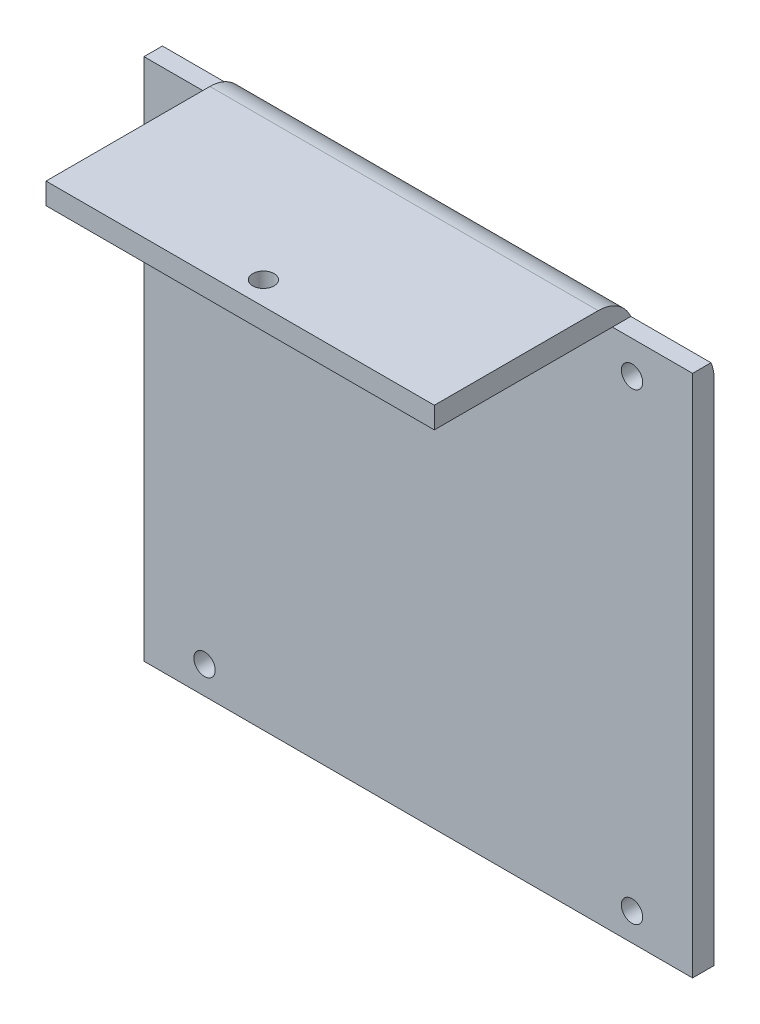
ISO-10303-21;
HEADER;
FILE_DESCRIPTION(('STEP AP214'),'2;1');
FILE_NAME('part.step','',(''),(''),'','','');
FILE_SCHEMA(('AUTOMOTIVE_DESIGN { 1 0 10303 214 1 1 1 1 }'));
ENDSEC;
DATA;
#1=APPLICATION_CONTEXT('core data for automotive mechanical design processes');
#2=APPLICATION_PROTOCOL_DEFINITION('international standard','automotive_design',2000,#1);
#3=PRODUCT_CONTEXT('',#1,'mechanical');
#4=PRODUCT('Part','Part','',(#3));
#5=PRODUCT_RELATED_PRODUCT_CATEGORY('part','',(#4));
#6=PRODUCT_DEFINITION_FORMATION('','',#4);
#7=PRODUCT_DEFINITION_CONTEXT('part definition',#1,'design');
#8=PRODUCT_DEFINITION('design','',#6,#7);
#9=PRODUCT_DEFINITION_SHAPE('','',#8);
#10=(LENGTH_UNIT() NAMED_UNIT(*) SI_UNIT(.MILLI.,.METRE.));
#11=(NAMED_UNIT(*) PLANE_ANGLE_UNIT() SI_UNIT($,.RADIAN.));
#12=(NAMED_UNIT(*) SI_UNIT($,.STERADIAN.) SOLID_ANGLE_UNIT());
#13=UNCERTAINTY_MEASURE_WITH_UNIT(LENGTH_MEASURE(1.E-05),#10,'distance_accuracy_value','');
#14=(GEOMETRIC_REPRESENTATION_CONTEXT(3) GLOBAL_UNCERTAINTY_ASSIGNED_CONTEXT((#13)) GLOBAL_UNIT_ASSIGNED_CONTEXT((#10,
#11,#12)) REPRESENTATION_CONTEXT('',''));
#15=CARTESIAN_POINT('',(0.,0.,0.));
#16=DIRECTION('',(0.,0.,1.));
#17=DIRECTION('',(1.,0.,0.));
#18=AXIS2_PLACEMENT_3D('',#15,#16,#17);
#19=CARTESIAN_POINT('',(-38.5,36.75,3.));
#20=DIRECTION('',(0.,-1.,0.));
#21=DIRECTION('',(0.,0.,-1.));
#22=AXIS2_PLACEMENT_3D('',#19,#20,#21);
#23=PLANE('',#22);
#24=DIRECTION('',(0.,0.,1.));
#25=VECTOR('',#24,1.);
#26=CARTESIAN_POINT('',(-27.25,36.75,0.));
#27=LINE('',#26,#25);
#28=CARTESIAN_POINT('',(-27.25,36.75,0.417424305044158));
#29=VERTEX_POINT('',#28);
#30=CARTESIAN_POINT('',(-27.25,36.75,3.));
#31=VERTEX_POINT('',#30);
#32=EDGE_CURVE('E139',#29,#31,#27,.T.);
#33=ORIENTED_EDGE('',*,*,#32,.F.);
#34=DIRECTION('',(1.,0.,0.));
#35=VECTOR('',#34,1.);
#36=CARTESIAN_POINT('',(-27.25,36.75,0.417424305044158));
#37=LINE('',#36,#35);
#38=CARTESIAN_POINT('',(-38.5,36.75,0.417424305044158));
#39=VERTEX_POINT('',#38);
#40=EDGE_CURVE('E209',#29,#39,#37,.F.);
#41=ORIENTED_EDGE('',*,*,#40,.T.);
#42=DIRECTION('',(0.,0.,-1.));
#43=VECTOR('',#42,1.);
#44=CARTESIAN_POINT('',(-38.5,36.75,3.));
#45=LINE('',#44,#43);
#46=CARTESIAN_POINT('',(-38.5,36.75,3.));
#47=VERTEX_POINT('',#46);
#48=EDGE_CURVE('E199',#47,#39,#45,.T.);
#49=ORIENTED_EDGE('',*,*,#48,.F.);
#50=DIRECTION('',(-1.,0.,0.));
#51=VECTOR('',#50,1.);
#52=CARTESIAN_POINT('',(-38.5,36.75,3.));
#53=LINE('',#52,#51);
#54=EDGE_CURVE('E181',#31,#47,#53,.T.);
#55=ORIENTED_EDGE('',*,*,#54,.F.);
#56=EDGE_LOOP('',(#33,#41,#49,#55));
#57=FACE_BOUND('',#56,.T.);
#58=ADVANCED_FACE('F35',(#57),#23,.F.);
#59=DIRECTION('',(0.,0.,-1.));
#60=VECTOR('',#59,1.);
#61=CARTESIAN_POINT('',(38.5,36.75,3.));
#62=LINE('',#61,#60);
#63=CARTESIAN_POINT('',(38.5,36.75,3.));
#64=VERTEX_POINT('',#63);
#65=CARTESIAN_POINT('',(38.5,36.75,0.417424305044158));
#66=VERTEX_POINT('',#65);
#67=EDGE_CURVE('E202',#64,#66,#62,.T.);
#68=ORIENTED_EDGE('',*,*,#67,.T.);
#69=DIRECTION('',(1.,0.,0.));
#70=VECTOR('',#69,1.);
#71=CARTESIAN_POINT('',(38.5,36.75,0.417424305044158));
#72=LINE('',#71,#70);
#73=CARTESIAN_POINT('',(27.25,36.75,0.417424305044158));
#74=VERTEX_POINT('',#73);
#75=EDGE_CURVE('E44',#66,#74,#72,.F.);
#76=ORIENTED_EDGE('',*,*,#75,.T.);
#77=DIRECTION('',(0.,0.,-1.));
#78=VECTOR('',#77,1.);
#79=CARTESIAN_POINT('',(27.25,36.75,0.));
#80=LINE('',#79,#78);
#81=CARTESIAN_POINT('',(27.25,36.75,3.));
#82=VERTEX_POINT('',#81);
#83=EDGE_CURVE('E142',#82,#74,#80,.T.);
#84=ORIENTED_EDGE('',*,*,#83,.F.);
#85=EDGE_CURVE('E183',#64,#82,#53,.T.);
#86=ORIENTED_EDGE('',*,*,#85,.F.);
#87=EDGE_LOOP('',(#68,#76,#84,#86));
#88=FACE_BOUND('',#87,.T.);
#89=ADVANCED_FACE('F256',(#88),#23,.F.);
#90=CARTESIAN_POINT('',(0.,0.,3.));
#91=DIRECTION('',(0.,0.,1.));
#92=DIRECTION('',(1.,0.,0.));
#93=AXIS2_PLACEMENT_3D('',#90,#91,#92);
#94=PLANE('',#93);
#95=DIRECTION('',(1.,0.,0.));
#96=VECTOR('',#95,1.);
#97=CARTESIAN_POINT('',(-27.25,36.75,3.));
#98=LINE('',#97,#96);
#99=EDGE_CURVE('E135',#31,#82,#98,.T.);
#100=ORIENTED_EDGE('',*,*,#99,.F.);
#101=ORIENTED_EDGE('',*,*,#54,.T.);
#102=DIRECTION('',(0.,-1.,0.));
#103=VECTOR('',#102,1.);
#104=CARTESIAN_POINT('',(-38.5,36.75,3.));
#105=LINE('',#104,#103);
#106=CARTESIAN_POINT('',(-38.5,-36.75,3.));
#107=VERTEX_POINT('',#106);
#108=EDGE_CURVE('E185',#47,#107,#105,.T.);
#109=ORIENTED_EDGE('',*,*,#108,.T.);
#110=DIRECTION('',(1.,0.,0.));
#111=VECTOR('',#110,1.);
#112=CARTESIAN_POINT('',(-38.5,-36.75,3.));
#113=LINE('',#112,#111);
#114=CARTESIAN_POINT('',(38.5,-36.75,3.));
#115=VERTEX_POINT('',#114);
#116=EDGE_CURVE('E187',#107,#115,#113,.T.);
#117=ORIENTED_EDGE('',*,*,#116,.T.);
#118=DIRECTION('',(0.,1.,0.));
#119=VECTOR('',#118,1.);
#120=CARTESIAN_POINT('',(38.5,36.75,3.));
#121=LINE('',#120,#119);
#122=EDGE_CURVE('E178',#115,#64,#121,.T.);
#123=ORIENTED_EDGE('',*,*,#122,.T.);
#124=ORIENTED_EDGE('',*,*,#85,.T.);
#125=EDGE_LOOP('',(#100,#101,#109,#117,#123,#124));
#126=FACE_BOUND('',#125,.T.);
#127=CARTESIAN_POINT('',(-30.,-32.85,3.));
#128=DIRECTION('',(0.,0.,1.));
#129=DIRECTION('',(1.,0.,0.));
#130=AXIS2_PLACEMENT_3D('',#127,#128,#129);
#131=CIRCLE('',#130,1.5);
#132=CARTESIAN_POINT('',(-28.5,-32.85,3.));
#133=VERTEX_POINT('',#132);
#134=EDGE_CURVE('E160',#133,#133,#131,.T.);
#135=ORIENTED_EDGE('',*,*,#134,.F.);
#136=EDGE_LOOP('',(#135));
#137=FACE_BOUND('',#136,.T.);
#138=CARTESIAN_POINT('',(30.,-32.85,3.));
#139=DIRECTION('',(0.,0.,1.));
#140=DIRECTION('',(1.,0.,0.));
#141=AXIS2_PLACEMENT_3D('',#138,#139,#140);
#142=CIRCLE('',#141,1.5);
#143=CARTESIAN_POINT('',(31.5,-32.85,3.));
#144=VERTEX_POINT('',#143);
#145=EDGE_CURVE('E172',#144,#144,#142,.T.);
#146=ORIENTED_EDGE('',*,*,#145,.F.);
#147=EDGE_LOOP('',(#146));
#148=FACE_BOUND('',#147,.T.);
#149=CARTESIAN_POINT('',(30.,32.15,3.));
#150=DIRECTION('',(0.,0.,1.));
#151=DIRECTION('',(1.,0.,0.));
#152=AXIS2_PLACEMENT_3D('',#149,#150,#151);
#153=CIRCLE('',#152,1.5);
#154=CARTESIAN_POINT('',(31.5,32.15,3.));
#155=VERTEX_POINT('',#154);
#156=EDGE_CURVE('E166',#155,#155,#153,.T.);
#157=ORIENTED_EDGE('',*,*,#156,.F.);
#158=EDGE_LOOP('',(#157));
#159=FACE_BOUND('',#158,.T.);
#160=CARTESIAN_POINT('',(-30.,32.15,3.));
#161=DIRECTION('',(0.,0.,1.));
#162=DIRECTION('',(1.,0.,0.));
#163=AXIS2_PLACEMENT_3D('',#160,#161,#162);
#164=CIRCLE('',#163,1.5);
#165=CARTESIAN_POINT('',(-28.5,32.15,3.));
#166=VERTEX_POINT('',#165);
#167=EDGE_CURVE('E154',#166,#166,#164,.T.);
#168=ORIENTED_EDGE('',*,*,#167,.F.);
#169=EDGE_LOOP('',(#168));
#170=FACE_BOUND('',#169,.T.);
#171=ADVANCED_FACE('F262',(#126,#137,#148,#159,#170),#94,.T.);
#172=CARTESIAN_POINT('',(0.,0.,0.));
#173=DIRECTION('',(0.,0.,1.));
#174=DIRECTION('',(1.,0.,0.));
#175=AXIS2_PLACEMENT_3D('',#172,#173,#174);
#176=PLANE('',#175);
#177=DIRECTION('',(0.,-1.,0.));
#178=VECTOR('',#177,1.);
#179=CARTESIAN_POINT('',(-38.5,36.75,0.));
#180=LINE('',#179,#178);
#181=CARTESIAN_POINT('',(-38.5,34.75,0.));
#182=VERTEX_POINT('',#181);
#183=CARTESIAN_POINT('',(-38.5,-36.75,0.));
#184=VERTEX_POINT('',#183);
#185=EDGE_CURVE('E191',#182,#184,#180,.T.);
#186=ORIENTED_EDGE('',*,*,#185,.F.);
#187=DIRECTION('',(-1.,0.,0.));
#188=VECTOR('',#187,1.);
#189=CARTESIAN_POINT('',(27.25,34.75,0.));
#190=LINE('',#189,#188);
#191=CARTESIAN_POINT('',(38.5,34.75,0.));
#192=VERTEX_POINT('',#191);
#193=EDGE_CURVE('E213',#182,#192,#190,.F.);
#194=ORIENTED_EDGE('',*,*,#193,.T.);
#195=DIRECTION('',(0.,1.,0.));
#196=VECTOR('',#195,1.);
#197=CARTESIAN_POINT('',(38.5,36.75,0.));
#198=LINE('',#197,#196);
#199=CARTESIAN_POINT('',(38.5,-36.75,0.));
#200=VERTEX_POINT('',#199);
#201=EDGE_CURVE('E175',#200,#192,#198,.T.);
#202=ORIENTED_EDGE('',*,*,#201,.F.);
#203=DIRECTION('',(1.,0.,0.));
#204=VECTOR('',#203,1.);
#205=CARTESIAN_POINT('',(-38.5,-36.75,0.));
#206=LINE('',#205,#204);
#207=EDGE_CURVE('E182',#184,#200,#206,.T.);
#208=ORIENTED_EDGE('',*,*,#207,.F.);
#209=EDGE_LOOP('',(#186,#194,#202,#208));
#210=FACE_BOUND('',#209,.T.);
#211=CARTESIAN_POINT('',(30.,-32.85,0.));
#212=DIRECTION('',(0.,0.,1.));
#213=DIRECTION('',(1.,0.,0.));
#214=AXIS2_PLACEMENT_3D('',#211,#212,#213);
#215=CIRCLE('',#214,1.5);
#216=CARTESIAN_POINT('',(31.5,-32.85,0.));
#217=VERTEX_POINT('',#216);
#218=EDGE_CURVE('E169',#217,#217,#215,.T.);
#219=ORIENTED_EDGE('',*,*,#218,.T.);
#220=EDGE_LOOP('',(#219));
#221=FACE_BOUND('',#220,.T.);
#222=CARTESIAN_POINT('',(30.,32.15,0.));
#223=DIRECTION('',(0.,0.,1.));
#224=DIRECTION('',(1.,0.,0.));
#225=AXIS2_PLACEMENT_3D('',#222,#223,#224);
#226=CIRCLE('',#225,1.5);
#227=CARTESIAN_POINT('',(31.5,32.15,0.));
#228=VERTEX_POINT('',#227);
#229=EDGE_CURVE('E163',#228,#228,#226,.T.);
#230=ORIENTED_EDGE('',*,*,#229,.T.);
#231=EDGE_LOOP('',(#230));
#232=FACE_BOUND('',#231,.T.);
#233=CARTESIAN_POINT('',(-30.,-32.85,0.));
#234=DIRECTION('',(0.,0.,1.));
#235=DIRECTION('',(1.,0.,0.));
#236=AXIS2_PLACEMENT_3D('',#233,#234,#235);
#237=CIRCLE('',#236,1.5);
#238=CARTESIAN_POINT('',(-28.5,-32.85,0.));
#239=VERTEX_POINT('',#238);
#240=EDGE_CURVE('E157',#239,#239,#237,.T.);
#241=ORIENTED_EDGE('',*,*,#240,.T.);
#242=EDGE_LOOP('',(#241));
#243=FACE_BOUND('',#242,.T.);
#244=CARTESIAN_POINT('',(-30.,32.15,0.));
#245=DIRECTION('',(0.,0.,1.));
#246=DIRECTION('',(1.,0.,0.));
#247=AXIS2_PLACEMENT_3D('',#244,#245,#246);
#248=CIRCLE('',#247,1.5);
#249=CARTESIAN_POINT('',(-28.5,32.15,0.));
#250=VERTEX_POINT('',#249);
#251=EDGE_CURVE('E151',#250,#250,#248,.T.);
#252=ORIENTED_EDGE('',*,*,#251,.T.);
#253=EDGE_LOOP('',(#252));
#254=FACE_BOUND('',#253,.T.);
#255=ADVANCED_FACE('F220',(#210,#221,#232,#243,#254),#176,.F.);
#256=CARTESIAN_POINT('',(38.5,36.75,3.));
#257=DIRECTION('',(-1.,0.,0.));
#258=DIRECTION('',(0.,-1.,0.));
#259=AXIS2_PLACEMENT_3D('',#256,#257,#258);
#260=PLANE('',#259);
#261=ORIENTED_EDGE('',*,*,#201,.T.);
#262=CARTESIAN_POINT('',(38.5,34.75,5.));
#263=DIRECTION('',(-1.,0.,0.));
#264=DIRECTION('',(0.,-1.,0.));
#265=AXIS2_PLACEMENT_3D('',#262,#263,#264);
#266=CIRCLE('',#265,5.);
#267=EDGE_CURVE('E58',#192,#66,#266,.F.);
#268=ORIENTED_EDGE('',*,*,#267,.T.);
#269=ORIENTED_EDGE('',*,*,#67,.F.);
#270=ORIENTED_EDGE('',*,*,#122,.F.);
#271=DIRECTION('',(0.,0.,-1.));
#272=VECTOR('',#271,1.);
#273=CARTESIAN_POINT('',(38.5,-36.75,3.));
#274=LINE('',#273,#272);
#275=EDGE_CURVE('E189',#115,#200,#274,.T.);
#276=ORIENTED_EDGE('',*,*,#275,.T.);
#277=EDGE_LOOP('',(#261,#268,#269,#270,#276));
#278=FACE_BOUND('',#277,.T.);
#279=ADVANCED_FACE('F225',(#278),#260,.F.);
#280=CARTESIAN_POINT('',(-38.5,36.75,3.));
#281=DIRECTION('',(1.,0.,0.));
#282=DIRECTION('',(0.,1.,0.));
#283=AXIS2_PLACEMENT_3D('',#280,#281,#282);
#284=PLANE('',#283);
#285=ORIENTED_EDGE('',*,*,#48,.T.);
#286=CARTESIAN_POINT('',(-38.5,34.75,5.));
#287=DIRECTION('',(1.,0.,0.));
#288=DIRECTION('',(0.,1.,0.));
#289=AXIS2_PLACEMENT_3D('',#286,#287,#288);
#290=CIRCLE('',#289,5.);
#291=EDGE_CURVE('E211',#39,#182,#290,.F.);
#292=ORIENTED_EDGE('',*,*,#291,.T.);
#293=ORIENTED_EDGE('',*,*,#185,.T.);
#294=DIRECTION('',(0.,0.,-1.));
#295=VECTOR('',#294,1.);
#296=CARTESIAN_POINT('',(-38.5,-36.75,3.));
#297=LINE('',#296,#295);
#298=EDGE_CURVE('E196',#107,#184,#297,.T.);
#299=ORIENTED_EDGE('',*,*,#298,.F.);
#300=ORIENTED_EDGE('',*,*,#108,.F.);
#301=EDGE_LOOP('',(#285,#292,#293,#299,#300));
#302=FACE_BOUND('',#301,.T.);
#303=ADVANCED_FACE('F264',(#302),#284,.F.);
#304=CARTESIAN_POINT('',(-38.5,-36.75,3.));
#305=DIRECTION('',(0.,1.,0.));
#306=DIRECTION('',(-1.,0.,0.));
#307=AXIS2_PLACEMENT_3D('',#304,#305,#306);
#308=PLANE('',#307);
#309=ORIENTED_EDGE('',*,*,#207,.T.);
#310=ORIENTED_EDGE('',*,*,#275,.F.);
#311=ORIENTED_EDGE('',*,*,#116,.F.);
#312=ORIENTED_EDGE('',*,*,#298,.T.);
#313=EDGE_LOOP('',(#309,#310,#311,#312));
#314=FACE_BOUND('',#313,.T.);
#315=ADVANCED_FACE('F271',(#314),#308,.F.);
#316=CARTESIAN_POINT('',(30.,-32.85,3.));
#317=DIRECTION('',(0.,0.,-1.));
#318=DIRECTION('',(-1.,0.,0.));
#319=AXIS2_PLACEMENT_3D('',#316,#317,#318);
#320=CYLINDRICAL_SURFACE('',#319,1.5);
#321=ORIENTED_EDGE('',*,*,#145,.T.);
#322=EDGE_LOOP('',(#321));
#323=FACE_BOUND('',#322,.T.);
#324=ORIENTED_EDGE('',*,*,#218,.F.);
#325=EDGE_LOOP('',(#324));
#326=FACE_BOUND('',#325,.T.);
#327=ADVANCED_FACE('F281',(#323,#326),#320,.F.);
#328=CARTESIAN_POINT('',(30.,32.15,3.));
#329=DIRECTION('',(0.,0.,-1.));
#330=DIRECTION('',(-1.,0.,0.));
#331=AXIS2_PLACEMENT_3D('',#328,#329,#330);
#332=CYLINDRICAL_SURFACE('',#331,1.5);
#333=ORIENTED_EDGE('',*,*,#156,.T.);
#334=EDGE_LOOP('',(#333));
#335=FACE_BOUND('',#334,.T.);
#336=ORIENTED_EDGE('',*,*,#229,.F.);
#337=EDGE_LOOP('',(#336));
#338=FACE_BOUND('',#337,.T.);
#339=ADVANCED_FACE('F286',(#335,#338),#332,.F.);
#340=CARTESIAN_POINT('',(-30.,-32.85,3.));
#341=DIRECTION('',(0.,0.,-1.));
#342=DIRECTION('',(-1.,0.,0.));
#343=AXIS2_PLACEMENT_3D('',#340,#341,#342);
#344=CYLINDRICAL_SURFACE('',#343,1.5);
#345=ORIENTED_EDGE('',*,*,#134,.T.);
#346=EDGE_LOOP('',(#345));
#347=FACE_BOUND('',#346,.T.);
#348=ORIENTED_EDGE('',*,*,#240,.F.);
#349=EDGE_LOOP('',(#348));
#350=FACE_BOUND('',#349,.T.);
#351=ADVANCED_FACE('F306',(#347,#350),#344,.F.);
#352=CARTESIAN_POINT('',(-30.,32.15,3.));
#353=DIRECTION('',(0.,0.,-1.));
#354=DIRECTION('',(-1.,0.,0.));
#355=AXIS2_PLACEMENT_3D('',#352,#353,#354);
#356=CYLINDRICAL_SURFACE('',#355,1.5);
#357=ORIENTED_EDGE('',*,*,#167,.T.);
#358=EDGE_LOOP('',(#357));
#359=FACE_BOUND('',#358,.T.);
#360=ORIENTED_EDGE('',*,*,#251,.F.);
#361=EDGE_LOOP('',(#360));
#362=FACE_BOUND('',#361,.T.);
#363=ADVANCED_FACE('F303',(#359,#362),#356,.F.);
#364=CARTESIAN_POINT('',(-27.25,39.75,0.));
#365=DIRECTION('',(1.,0.,0.));
#366=DIRECTION('',(0.,0.,-1.));
#367=AXIS2_PLACEMENT_3D('',#364,#365,#366);
#368=PLANE('',#367);
#369=DIRECTION('',(0.,0.,1.));
#370=VECTOR('',#369,1.);
#371=CARTESIAN_POINT('',(-27.25,39.75,0.));
#372=LINE('',#371,#370);
#373=CARTESIAN_POINT('',(-27.25,39.75,5.));
#374=VERTEX_POINT('',#373);
#375=CARTESIAN_POINT('',(-27.25,39.75,28.));
#376=VERTEX_POINT('',#375);
#377=EDGE_CURVE('E147',#374,#376,#372,.T.);
#378=ORIENTED_EDGE('',*,*,#377,.F.);
#379=CARTESIAN_POINT('',(-27.25,34.75,5.));
#380=DIRECTION('',(1.,0.,0.));
#381=DIRECTION('',(0.,0.,-1.));
#382=AXIS2_PLACEMENT_3D('',#379,#380,#381);
#383=CIRCLE('',#382,5.);
#384=EDGE_CURVE('E207',#374,#29,#383,.F.);
#385=ORIENTED_EDGE('',*,*,#384,.T.);
#386=ORIENTED_EDGE('',*,*,#32,.T.);
#387=DIRECTION('',(0.,0.,-1.));
#388=VECTOR('',#387,1.);
#389=CARTESIAN_POINT('',(-27.25,36.75,28.));
#390=LINE('',#389,#388);
#391=CARTESIAN_POINT('',(-27.25,36.75,28.));
#392=VERTEX_POINT('',#391);
#393=EDGE_CURVE('E119',#392,#31,#390,.T.);
#394=ORIENTED_EDGE('',*,*,#393,.F.);
#395=DIRECTION('',(0.,-1.,0.));
#396=VECTOR('',#395,1.);
#397=CARTESIAN_POINT('',(-27.25,39.75,28.));
#398=LINE('',#397,#396);
#399=EDGE_CURVE('E126',#376,#392,#398,.T.);
#400=ORIENTED_EDGE('',*,*,#399,.F.);
#401=EDGE_LOOP('',(#378,#385,#386,#394,#400));
#402=FACE_BOUND('',#401,.T.);
#403=ADVANCED_FACE('F137',(#402),#368,.F.);
#404=CARTESIAN_POINT('',(27.25,39.75,0.));
#405=DIRECTION('',(-1.,0.,0.));
#406=DIRECTION('',(0.,0.,1.));
#407=AXIS2_PLACEMENT_3D('',#404,#405,#406);
#408=PLANE('',#407);
#409=ORIENTED_EDGE('',*,*,#83,.T.);
#410=CARTESIAN_POINT('',(27.25,34.75,5.));
#411=DIRECTION('',(-1.,0.,0.));
#412=DIRECTION('',(0.,0.,1.));
#413=AXIS2_PLACEMENT_3D('',#410,#411,#412);
#414=CIRCLE('',#413,5.);
#415=CARTESIAN_POINT('',(27.25,39.75,5.));
#416=VERTEX_POINT('',#415);
#417=EDGE_CURVE('E11',#74,#416,#414,.F.);
#418=ORIENTED_EDGE('',*,*,#417,.T.);
#419=DIRECTION('',(0.,0.,-1.));
#420=VECTOR('',#419,1.);
#421=CARTESIAN_POINT('',(27.25,39.75,0.));
#422=LINE('',#421,#420);
#423=CARTESIAN_POINT('',(27.25,39.75,28.));
#424=VERTEX_POINT('',#423);
#425=EDGE_CURVE('E149',#424,#416,#422,.T.);
#426=ORIENTED_EDGE('',*,*,#425,.F.);
#427=DIRECTION('',(0.,1.,0.));
#428=VECTOR('',#427,1.);
#429=CARTESIAN_POINT('',(27.25,39.75,28.));
#430=LINE('',#429,#428);
#431=CARTESIAN_POINT('',(27.25,36.75,28.));
#432=VERTEX_POINT('',#431);
#433=EDGE_CURVE('E125',#432,#424,#430,.T.);
#434=ORIENTED_EDGE('',*,*,#433,.F.);
#435=DIRECTION('',(0.,0.,-1.));
#436=VECTOR('',#435,1.);
#437=CARTESIAN_POINT('',(27.25,36.75,28.));
#438=LINE('',#437,#436);
#439=EDGE_CURVE('E121',#432,#82,#438,.T.);
#440=ORIENTED_EDGE('',*,*,#439,.T.);
#441=EDGE_LOOP('',(#409,#418,#426,#434,#440));
#442=FACE_BOUND('',#441,.T.);
#443=ADVANCED_FACE('F231',(#442),#408,.F.);
#444=CARTESIAN_POINT('',(0.,39.75,0.));
#445=DIRECTION('',(0.,1.,0.));
#446=DIRECTION('',(0.,0.,1.));
#447=AXIS2_PLACEMENT_3D('',#444,#445,#446);
#448=PLANE('',#447);
#449=CARTESIAN_POINT('',(0.,39.75,24.7425830477031));
#450=DIRECTION('',(0.,1.,0.));
#451=DIRECTION('',(0.,0.,1.));
#452=AXIS2_PLACEMENT_3D('',#449,#450,#451);
#453=CIRCLE('',#452,1.5);
#454=CARTESIAN_POINT('',(0.,39.75,26.2425830477031));
#455=VERTEX_POINT('',#454);
#456=EDGE_CURVE('E237',#455,#455,#453,.T.);
#457=ORIENTED_EDGE('',*,*,#456,.F.);
#458=EDGE_LOOP('',(#457));
#459=FACE_BOUND('',#458,.T.);
#460=ORIENTED_EDGE('',*,*,#425,.T.);
#461=DIRECTION('',(-1.,0.,0.));
#462=VECTOR('',#461,1.);
#463=CARTESIAN_POINT('',(-27.25,39.75,5.));
#464=LINE('',#463,#462);
#465=EDGE_CURVE('E204',#416,#374,#464,.T.);
#466=ORIENTED_EDGE('',*,*,#465,.T.);
#467=ORIENTED_EDGE('',*,*,#377,.T.);
#468=DIRECTION('',(-1.,0.,0.));
#469=VECTOR('',#468,1.);
#470=CARTESIAN_POINT('',(-27.25,39.75,28.));
#471=LINE('',#470,#469);
#472=EDGE_CURVE('E132',#424,#376,#471,.T.);
#473=ORIENTED_EDGE('',*,*,#472,.F.);
#474=EDGE_LOOP('',(#460,#466,#467,#473));
#475=FACE_BOUND('',#474,.T.);
#476=ADVANCED_FACE('F233',(#459,#475),#448,.T.);
#477=CARTESIAN_POINT('',(-27.25,36.75,28.));
#478=DIRECTION('',(0.,1.,0.));
#479=DIRECTION('',(0.,0.,1.));
#480=AXIS2_PLACEMENT_3D('',#477,#478,#479);
#481=PLANE('',#480);
#482=CARTESIAN_POINT('',(0.,36.75,24.7425830477031));
#483=DIRECTION('',(0.,1.,0.));
#484=DIRECTION('',(0.,0.,1.));
#485=AXIS2_PLACEMENT_3D('',#482,#483,#484);
#486=CIRCLE('',#485,1.5);
#487=CARTESIAN_POINT('',(0.,36.75,26.2425830477031));
#488=VERTEX_POINT('',#487);
#489=EDGE_CURVE('E39',#488,#488,#486,.T.);
#490=ORIENTED_EDGE('',*,*,#489,.T.);
#491=EDGE_LOOP('',(#490));
#492=FACE_BOUND('',#491,.T.);
#493=ORIENTED_EDGE('',*,*,#99,.T.);
#494=ORIENTED_EDGE('',*,*,#439,.F.);
#495=DIRECTION('',(1.,0.,0.));
#496=VECTOR('',#495,1.);
#497=CARTESIAN_POINT('',(-27.25,36.75,28.));
#498=LINE('',#497,#496);
#499=EDGE_CURVE('E114',#392,#432,#498,.T.);
#500=ORIENTED_EDGE('',*,*,#499,.F.);
#501=ORIENTED_EDGE('',*,*,#393,.T.);
#502=EDGE_LOOP('',(#493,#494,#500,#501));
#503=FACE_BOUND('',#502,.T.);
#504=ADVANCED_FACE('F117',(#492,#503),#481,.F.);
#505=CARTESIAN_POINT('',(0.,0.,28.));
#506=DIRECTION('',(0.,0.,1.));
#507=DIRECTION('',(1.,0.,0.));
#508=AXIS2_PLACEMENT_3D('',#505,#506,#507);
#509=PLANE('',#508);
#510=ORIENTED_EDGE('',*,*,#399,.T.);
#511=ORIENTED_EDGE('',*,*,#499,.T.);
#512=ORIENTED_EDGE('',*,*,#433,.T.);
#513=ORIENTED_EDGE('',*,*,#472,.T.);
#514=EDGE_LOOP('',(#510,#511,#512,#513));
#515=FACE_BOUND('',#514,.T.);
#516=ADVANCED_FACE('F130',(#515),#509,.T.);
#517=CARTESIAN_POINT('',(0.,34.75,5.));
#518=DIRECTION('',(1.,0.,0.));
#519=DIRECTION('',(0.,0.,-1.));
#520=AXIS2_PLACEMENT_3D('',#517,#518,#519);
#521=CYLINDRICAL_SURFACE('',#520,5.);
#522=ORIENTED_EDGE('',*,*,#267,.F.);
#523=ORIENTED_EDGE('',*,*,#193,.F.);
#524=ORIENTED_EDGE('',*,*,#291,.F.);
#525=ORIENTED_EDGE('',*,*,#40,.F.);
#526=ORIENTED_EDGE('',*,*,#384,.F.);
#527=ORIENTED_EDGE('',*,*,#465,.F.);
#528=ORIENTED_EDGE('',*,*,#417,.F.);
#529=ORIENTED_EDGE('',*,*,#75,.F.);
#530=EDGE_LOOP('',(#522,#523,#524,#525,#526,#527,#528,#529));
#531=FACE_BOUND('',#530,.T.);
#532=ADVANCED_FACE('F37',(#531),#521,.T.);
#533=CARTESIAN_POINT('',(0.,14.75,24.7425830477031));
#534=DIRECTION('',(0.,1.,0.));
#535=DIRECTION('',(0.,0.,1.));
#536=AXIS2_PLACEMENT_3D('',#533,#534,#535);
#537=CYLINDRICAL_SURFACE('',#536,1.5);
#538=ORIENTED_EDGE('',*,*,#456,.T.);
#539=EDGE_LOOP('',(#538));
#540=FACE_BOUND('',#539,.T.);
#541=ORIENTED_EDGE('',*,*,#489,.F.);
#542=EDGE_LOOP('',(#541));
#543=FACE_BOUND('',#542,.T.);
#544=ADVANCED_FACE('F244',(#540,#543),#537,.F.);
#545=CLOSED_SHELL('',(#58,#89,#171,#255,#279,#303,#315,#327,#339,#351,#363,#403,#443,#476,#504,
#516,#532,#544));
#546=MANIFOLD_SOLID_BREP('B2',#545);
#547=ADVANCED_BREP_SHAPE_REPRESENTATION('',(#18,#546),#14);
#548=SHAPE_DEFINITION_REPRESENTATION(#9,#547);
ENDSEC;
END-ISO-10303-21;
